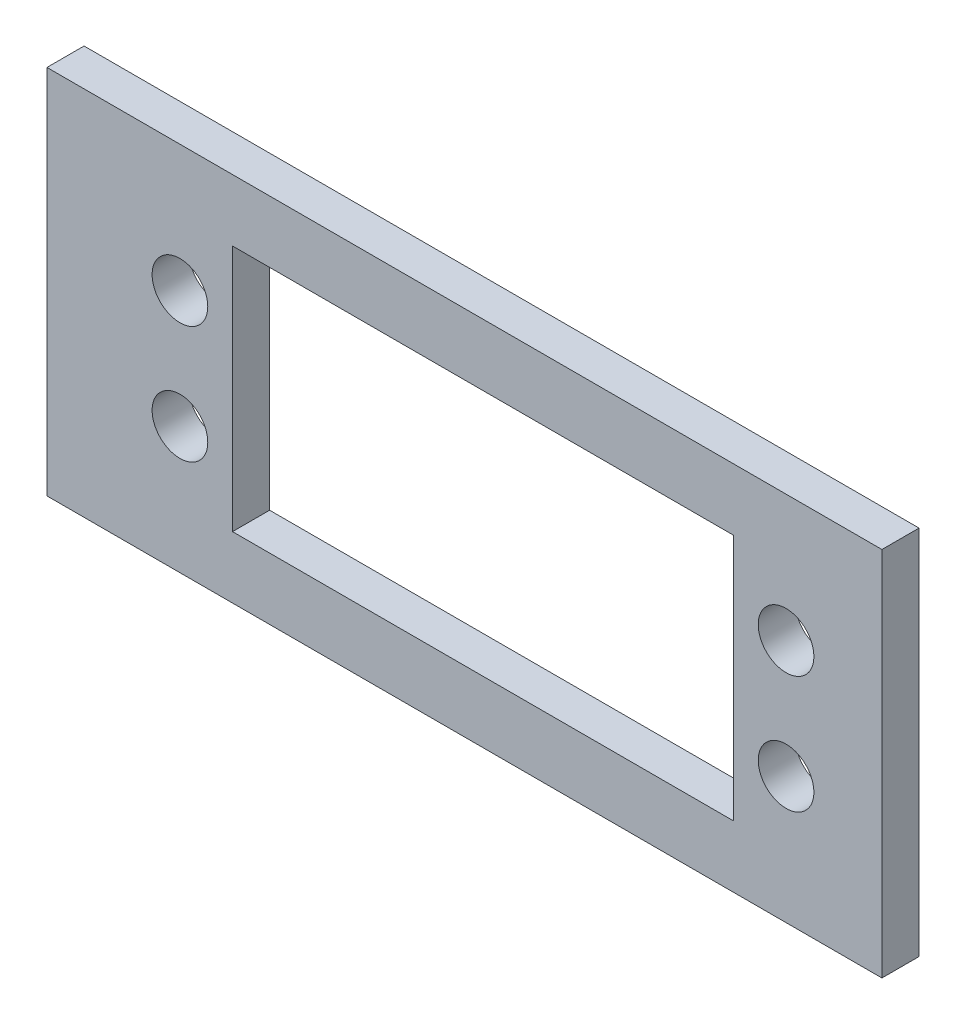
ISO-10303-21;
HEADER;
FILE_DESCRIPTION(('STEP AP214'),'2;1');
FILE_NAME('part.step','',(''),(''),'','','');
FILE_SCHEMA(('AUTOMOTIVE_DESIGN { 1 0 10303 214 1 1 1 1 }'));
ENDSEC;
DATA;
#1=APPLICATION_CONTEXT('core data for automotive mechanical design processes');
#2=APPLICATION_PROTOCOL_DEFINITION('international standard','automotive_design',2000,#1);
#3=PRODUCT_CONTEXT('',#1,'mechanical');
#4=PRODUCT('Part','Part','',(#3));
#5=PRODUCT_RELATED_PRODUCT_CATEGORY('part','',(#4));
#6=PRODUCT_DEFINITION_FORMATION('','',#4);
#7=PRODUCT_DEFINITION_CONTEXT('part definition',#1,'design');
#8=PRODUCT_DEFINITION('design','',#6,#7);
#9=PRODUCT_DEFINITION_SHAPE('','',#8);
#10=(LENGTH_UNIT() NAMED_UNIT(*) SI_UNIT(.MILLI.,.METRE.));
#11=(NAMED_UNIT(*) PLANE_ANGLE_UNIT() SI_UNIT($,.RADIAN.));
#12=(NAMED_UNIT(*) SI_UNIT($,.STERADIAN.) SOLID_ANGLE_UNIT());
#13=UNCERTAINTY_MEASURE_WITH_UNIT(LENGTH_MEASURE(1.E-05),#10,'distance_accuracy_value','');
#14=(GEOMETRIC_REPRESENTATION_CONTEXT(3) GLOBAL_UNCERTAINTY_ASSIGNED_CONTEXT((#13)) GLOBAL_UNIT_ASSIGNED_CONTEXT((#10,
#11,#12)) REPRESENTATION_CONTEXT('',''));
#15=CARTESIAN_POINT('',(0.,0.,0.));
#16=DIRECTION('',(0.,0.,1.));
#17=DIRECTION('',(1.,0.,0.));
#18=AXIS2_PLACEMENT_3D('',#15,#16,#17);
#19=CARTESIAN_POINT('',(0.,0.,3.));
#20=DIRECTION('',(0.,0.,-1.));
#21=DIRECTION('',(-1.,0.,0.));
#22=AXIS2_PLACEMENT_3D('',#19,#20,#21);
#23=PLANE('',#22);
#24=CARTESIAN_POINT('',(59.75,19.75,3.));
#25=DIRECTION('',(0.,0.,1.));
#26=DIRECTION('',(1.,0.,0.));
#27=AXIS2_PLACEMENT_3D('',#24,#25,#26);
#28=CIRCLE('',#27,2.25);
#29=CARTESIAN_POINT('',(62.,19.75,3.));
#30=VERTEX_POINT('',#29);
#31=EDGE_CURVE('E249',#30,#30,#28,.T.);
#32=ORIENTED_EDGE('',*,*,#31,.F.);
#33=EDGE_LOOP('',(#32));
#34=FACE_BOUND('',#33,.T.);
#35=CARTESIAN_POINT('',(10.75,19.75,3.));
#36=DIRECTION('',(0.,0.,1.));
#37=DIRECTION('',(1.,0.,0.));
#38=AXIS2_PLACEMENT_3D('',#35,#36,#37);
#39=CIRCLE('',#38,2.25);
#40=CARTESIAN_POINT('',(13.,19.75,3.));
#41=VERTEX_POINT('',#40);
#42=EDGE_CURVE('E130',#41,#41,#39,.T.);
#43=ORIENTED_EDGE('',*,*,#42,.F.);
#44=EDGE_LOOP('',(#43));
#45=FACE_BOUND('',#44,.T.);
#46=DIRECTION('',(0.,-1.,0.));
#47=VECTOR('',#46,1.);
#48=CARTESIAN_POINT('',(0.,0.,3.));
#49=LINE('',#48,#47);
#50=CARTESIAN_POINT('',(0.,30.,3.));
#51=VERTEX_POINT('',#50);
#52=CARTESIAN_POINT('',(0.,0.,3.));
#53=VERTEX_POINT('',#52);
#54=EDGE_CURVE('E140',#51,#53,#49,.T.);
#55=ORIENTED_EDGE('',*,*,#54,.T.);
#56=DIRECTION('',(1.,0.,0.));
#57=VECTOR('',#56,1.);
#58=CARTESIAN_POINT('',(0.,0.,3.));
#59=LINE('',#58,#57);
#60=CARTESIAN_POINT('',(67.5,0.,3.));
#61=VERTEX_POINT('',#60);
#62=EDGE_CURVE('E143',#53,#61,#59,.T.);
#63=ORIENTED_EDGE('',*,*,#62,.T.);
#64=DIRECTION('',(0.,1.,0.));
#65=VECTOR('',#64,1.);
#66=CARTESIAN_POINT('',(67.5,0.,3.));
#67=LINE('',#66,#65);
#68=CARTESIAN_POINT('',(67.5,30.,3.));
#69=VERTEX_POINT('',#68);
#70=EDGE_CURVE('E146',#61,#69,#67,.T.);
#71=ORIENTED_EDGE('',*,*,#70,.T.);
#72=DIRECTION('',(-1.,0.,0.));
#73=VECTOR('',#72,1.);
#74=CARTESIAN_POINT('',(0.,30.,3.));
#75=LINE('',#74,#73);
#76=EDGE_CURVE('E148',#69,#51,#75,.T.);
#77=ORIENTED_EDGE('',*,*,#76,.T.);
#78=EDGE_LOOP('',(#55,#63,#71,#77));
#79=FACE_BOUND('',#78,.T.);
#80=DIRECTION('',(0.,-1.,0.));
#81=VECTOR('',#80,1.);
#82=CARTESIAN_POINT('',(15.,5.,3.));
#83=LINE('',#82,#81);
#84=CARTESIAN_POINT('',(15.,25.,3.));
#85=VERTEX_POINT('',#84);
#86=CARTESIAN_POINT('',(15.,5.,3.));
#87=VERTEX_POINT('',#86);
#88=EDGE_CURVE('E101',#85,#87,#83,.T.);
#89=ORIENTED_EDGE('',*,*,#88,.F.);
#90=DIRECTION('',(-1.,0.,0.));
#91=VECTOR('',#90,1.);
#92=CARTESIAN_POINT('',(15.,25.,3.));
#93=LINE('',#92,#91);
#94=CARTESIAN_POINT('',(55.5,25.,3.));
#95=VERTEX_POINT('',#94);
#96=EDGE_CURVE('E124',#95,#85,#93,.T.);
#97=ORIENTED_EDGE('',*,*,#96,.F.);
#98=DIRECTION('',(0.,1.,0.));
#99=VECTOR('',#98,1.);
#100=CARTESIAN_POINT('',(55.5,5.,3.));
#101=LINE('',#100,#99);
#102=CARTESIAN_POINT('',(55.5,5.,3.));
#103=VERTEX_POINT('',#102);
#104=EDGE_CURVE('E122',#103,#95,#101,.T.);
#105=ORIENTED_EDGE('',*,*,#104,.F.);
#106=DIRECTION('',(1.,0.,0.));
#107=VECTOR('',#106,1.);
#108=CARTESIAN_POINT('',(15.,5.,3.));
#109=LINE('',#108,#107);
#110=EDGE_CURVE('E109',#87,#103,#109,.T.);
#111=ORIENTED_EDGE('',*,*,#110,.F.);
#112=EDGE_LOOP('',(#89,#97,#105,#111));
#113=FACE_BOUND('',#112,.T.);
#114=CARTESIAN_POINT('',(10.75,10.25,3.));
#115=DIRECTION('',(0.,0.,1.));
#116=DIRECTION('',(1.,0.,0.));
#117=AXIS2_PLACEMENT_3D('',#114,#115,#116);
#118=CIRCLE('',#117,2.25);
#119=CARTESIAN_POINT('',(13.,10.25,3.));
#120=VERTEX_POINT('',#119);
#121=EDGE_CURVE('E255',#120,#120,#118,.T.);
#122=ORIENTED_EDGE('',*,*,#121,.F.);
#123=EDGE_LOOP('',(#122));
#124=FACE_BOUND('',#123,.T.);
#125=CARTESIAN_POINT('',(59.75,10.25,3.));
#126=DIRECTION('',(0.,0.,1.));
#127=DIRECTION('',(1.,0.,0.));
#128=AXIS2_PLACEMENT_3D('',#125,#126,#127);
#129=CIRCLE('',#128,2.25);
#130=CARTESIAN_POINT('',(62.,10.25,3.));
#131=VERTEX_POINT('',#130);
#132=EDGE_CURVE('E240',#131,#131,#129,.T.);
#133=ORIENTED_EDGE('',*,*,#132,.F.);
#134=EDGE_LOOP('',(#133));
#135=FACE_BOUND('',#134,.T.);
#136=ADVANCED_FACE('F36',(#34,#45,#79,#113,#124,#135),#23,.F.);
#137=CARTESIAN_POINT('',(0.,0.,0.));
#138=DIRECTION('',(0.,0.,-1.));
#139=DIRECTION('',(-1.,0.,0.));
#140=AXIS2_PLACEMENT_3D('',#137,#138,#139);
#141=PLANE('',#140);
#142=CARTESIAN_POINT('',(59.75,19.75,0.));
#143=DIRECTION('',(0.,0.,1.));
#144=DIRECTION('',(1.,0.,0.));
#145=AXIS2_PLACEMENT_3D('',#142,#143,#144);
#146=CIRCLE('',#145,2.25);
#147=CARTESIAN_POINT('',(62.,19.75,0.));
#148=VERTEX_POINT('',#147);
#149=EDGE_CURVE('E246',#148,#148,#146,.T.);
#150=ORIENTED_EDGE('',*,*,#149,.T.);
#151=EDGE_LOOP('',(#150));
#152=FACE_BOUND('',#151,.T.);
#153=CARTESIAN_POINT('',(10.75,19.75,0.));
#154=DIRECTION('',(0.,0.,1.));
#155=DIRECTION('',(1.,0.,0.));
#156=AXIS2_PLACEMENT_3D('',#153,#154,#155);
#157=CIRCLE('',#156,2.25);
#158=CARTESIAN_POINT('',(13.,19.75,0.));
#159=VERTEX_POINT('',#158);
#160=EDGE_CURVE('E258',#159,#159,#157,.T.);
#161=ORIENTED_EDGE('',*,*,#160,.T.);
#162=EDGE_LOOP('',(#161));
#163=FACE_BOUND('',#162,.T.);
#164=DIRECTION('',(0.,-1.,0.));
#165=VECTOR('',#164,1.);
#166=CARTESIAN_POINT('',(0.,0.,0.));
#167=LINE('',#166,#165);
#168=CARTESIAN_POINT('',(0.,30.,0.));
#169=VERTEX_POINT('',#168);
#170=CARTESIAN_POINT('',(0.,0.,0.));
#171=VERTEX_POINT('',#170);
#172=EDGE_CURVE('E117',#169,#171,#167,.T.);
#173=ORIENTED_EDGE('',*,*,#172,.F.);
#174=DIRECTION('',(-1.,0.,0.));
#175=VECTOR('',#174,1.);
#176=CARTESIAN_POINT('',(0.,30.,0.));
#177=LINE('',#176,#175);
#178=CARTESIAN_POINT('',(67.5,30.,0.));
#179=VERTEX_POINT('',#178);
#180=EDGE_CURVE('E144',#179,#169,#177,.T.);
#181=ORIENTED_EDGE('',*,*,#180,.F.);
#182=DIRECTION('',(0.,1.,0.));
#183=VECTOR('',#182,1.);
#184=CARTESIAN_POINT('',(67.5,0.,0.));
#185=LINE('',#184,#183);
#186=CARTESIAN_POINT('',(67.5,0.,0.));
#187=VERTEX_POINT('',#186);
#188=EDGE_CURVE('E155',#187,#179,#185,.T.);
#189=ORIENTED_EDGE('',*,*,#188,.F.);
#190=DIRECTION('',(1.,0.,0.));
#191=VECTOR('',#190,1.);
#192=CARTESIAN_POINT('',(0.,0.,0.));
#193=LINE('',#192,#191);
#194=EDGE_CURVE('E153',#171,#187,#193,.T.);
#195=ORIENTED_EDGE('',*,*,#194,.F.);
#196=EDGE_LOOP('',(#173,#181,#189,#195));
#197=FACE_BOUND('',#196,.T.);
#198=DIRECTION('',(-1.,0.,0.));
#199=VECTOR('',#198,1.);
#200=CARTESIAN_POINT('',(15.,25.,0.));
#201=LINE('',#200,#199);
#202=CARTESIAN_POINT('',(55.5,25.,0.));
#203=VERTEX_POINT('',#202);
#204=CARTESIAN_POINT('',(15.,25.,0.));
#205=VERTEX_POINT('',#204);
#206=EDGE_CURVE('E110',#203,#205,#201,.T.);
#207=ORIENTED_EDGE('',*,*,#206,.T.);
#208=DIRECTION('',(0.,-1.,0.));
#209=VECTOR('',#208,1.);
#210=CARTESIAN_POINT('',(15.,5.,0.));
#211=LINE('',#210,#209);
#212=CARTESIAN_POINT('',(15.,5.,0.));
#213=VERTEX_POINT('',#212);
#214=EDGE_CURVE('E59',#205,#213,#211,.T.);
#215=ORIENTED_EDGE('',*,*,#214,.T.);
#216=DIRECTION('',(1.,0.,0.));
#217=VECTOR('',#216,1.);
#218=CARTESIAN_POINT('',(15.,5.,0.));
#219=LINE('',#218,#217);
#220=CARTESIAN_POINT('',(55.5,5.,0.));
#221=VERTEX_POINT('',#220);
#222=EDGE_CURVE('E116',#213,#221,#219,.T.);
#223=ORIENTED_EDGE('',*,*,#222,.T.);
#224=DIRECTION('',(0.,1.,0.));
#225=VECTOR('',#224,1.);
#226=CARTESIAN_POINT('',(55.5,5.,0.));
#227=LINE('',#226,#225);
#228=EDGE_CURVE('E132',#221,#203,#227,.T.);
#229=ORIENTED_EDGE('',*,*,#228,.T.);
#230=EDGE_LOOP('',(#207,#215,#223,#229));
#231=FACE_BOUND('',#230,.T.);
#232=CARTESIAN_POINT('',(10.75,10.25,0.));
#233=DIRECTION('',(0.,0.,1.));
#234=DIRECTION('',(1.,0.,0.));
#235=AXIS2_PLACEMENT_3D('',#232,#233,#234);
#236=CIRCLE('',#235,2.25);
#237=CARTESIAN_POINT('',(13.,10.25,0.));
#238=VERTEX_POINT('',#237);
#239=EDGE_CURVE('E252',#238,#238,#236,.T.);
#240=ORIENTED_EDGE('',*,*,#239,.T.);
#241=EDGE_LOOP('',(#240));
#242=FACE_BOUND('',#241,.T.);
#243=CARTESIAN_POINT('',(59.75,10.25,0.));
#244=DIRECTION('',(0.,0.,1.));
#245=DIRECTION('',(1.,0.,0.));
#246=AXIS2_PLACEMENT_3D('',#243,#244,#245);
#247=CIRCLE('',#246,2.25);
#248=CARTESIAN_POINT('',(62.,10.25,0.));
#249=VERTEX_POINT('',#248);
#250=EDGE_CURVE('E243',#249,#249,#247,.T.);
#251=ORIENTED_EDGE('',*,*,#250,.T.);
#252=EDGE_LOOP('',(#251));
#253=FACE_BOUND('',#252,.T.);
#254=ADVANCED_FACE('F173',(#152,#163,#197,#231,#242,#253),#141,.T.);
#255=CARTESIAN_POINT('',(0.,0.,3.));
#256=DIRECTION('',(1.,0.,0.));
#257=DIRECTION('',(0.,0.,-1.));
#258=AXIS2_PLACEMENT_3D('',#255,#256,#257);
#259=PLANE('',#258);
#260=ORIENTED_EDGE('',*,*,#172,.T.);
#261=DIRECTION('',(0.,0.,-1.));
#262=VECTOR('',#261,1.);
#263=CARTESIAN_POINT('',(0.,0.,3.));
#264=LINE('',#263,#262);
#265=EDGE_CURVE('E11',#53,#171,#264,.T.);
#266=ORIENTED_EDGE('',*,*,#265,.F.);
#267=ORIENTED_EDGE('',*,*,#54,.F.);
#268=DIRECTION('',(0.,0.,-1.));
#269=VECTOR('',#268,1.);
#270=CARTESIAN_POINT('',(0.,30.,3.));
#271=LINE('',#270,#269);
#272=EDGE_CURVE('E150',#51,#169,#271,.T.);
#273=ORIENTED_EDGE('',*,*,#272,.T.);
#274=EDGE_LOOP('',(#260,#266,#267,#273));
#275=FACE_BOUND('',#274,.T.);
#276=ADVANCED_FACE('F38',(#275),#259,.F.);
#277=CARTESIAN_POINT('',(0.,0.,3.));
#278=DIRECTION('',(0.,1.,0.));
#279=DIRECTION('',(0.,0.,1.));
#280=AXIS2_PLACEMENT_3D('',#277,#278,#279);
#281=PLANE('',#280);
#282=ORIENTED_EDGE('',*,*,#194,.T.);
#283=DIRECTION('',(0.,0.,-1.));
#284=VECTOR('',#283,1.);
#285=CARTESIAN_POINT('',(67.5,0.,3.));
#286=LINE('',#285,#284);
#287=EDGE_CURVE('E44',#61,#187,#286,.T.);
#288=ORIENTED_EDGE('',*,*,#287,.F.);
#289=ORIENTED_EDGE('',*,*,#62,.F.);
#290=ORIENTED_EDGE('',*,*,#265,.T.);
#291=EDGE_LOOP('',(#282,#288,#289,#290));
#292=FACE_BOUND('',#291,.T.);
#293=ADVANCED_FACE('F183',(#292),#281,.F.);
#294=CARTESIAN_POINT('',(67.5,0.,3.));
#295=DIRECTION('',(-1.,0.,0.));
#296=DIRECTION('',(0.,0.,1.));
#297=AXIS2_PLACEMENT_3D('',#294,#295,#296);
#298=PLANE('',#297);
#299=ORIENTED_EDGE('',*,*,#188,.T.);
#300=DIRECTION('',(0.,0.,-1.));
#301=VECTOR('',#300,1.);
#302=CARTESIAN_POINT('',(67.5,30.,3.));
#303=LINE('',#302,#301);
#304=EDGE_CURVE('E160',#69,#179,#303,.T.);
#305=ORIENTED_EDGE('',*,*,#304,.F.);
#306=ORIENTED_EDGE('',*,*,#70,.F.);
#307=ORIENTED_EDGE('',*,*,#287,.T.);
#308=EDGE_LOOP('',(#299,#305,#306,#307));
#309=FACE_BOUND('',#308,.T.);
#310=ADVANCED_FACE('F167',(#309),#298,.F.);
#311=CARTESIAN_POINT('',(0.,30.,3.));
#312=DIRECTION('',(0.,-1.,0.));
#313=DIRECTION('',(0.,0.,-1.));
#314=AXIS2_PLACEMENT_3D('',#311,#312,#313);
#315=PLANE('',#314);
#316=ORIENTED_EDGE('',*,*,#180,.T.);
#317=ORIENTED_EDGE('',*,*,#272,.F.);
#318=ORIENTED_EDGE('',*,*,#76,.F.);
#319=ORIENTED_EDGE('',*,*,#304,.T.);
#320=EDGE_LOOP('',(#316,#317,#318,#319));
#321=FACE_BOUND('',#320,.T.);
#322=ADVANCED_FACE('F177',(#321),#315,.F.);
#323=CARTESIAN_POINT('',(15.,5.,3.));
#324=DIRECTION('',(1.,0.,0.));
#325=DIRECTION('',(0.,0.,-1.));
#326=AXIS2_PLACEMENT_3D('',#323,#324,#325);
#327=PLANE('',#326);
#328=ORIENTED_EDGE('',*,*,#214,.F.);
#329=DIRECTION('',(0.,0.,-1.));
#330=VECTOR('',#329,1.);
#331=CARTESIAN_POINT('',(15.,25.,3.));
#332=LINE('',#331,#330);
#333=EDGE_CURVE('E105',#85,#205,#332,.T.);
#334=ORIENTED_EDGE('',*,*,#333,.F.);
#335=ORIENTED_EDGE('',*,*,#88,.T.);
#336=DIRECTION('',(0.,0.,-1.));
#337=VECTOR('',#336,1.);
#338=CARTESIAN_POINT('',(15.,5.,3.));
#339=LINE('',#338,#337);
#340=EDGE_CURVE('E104',#87,#213,#339,.T.);
#341=ORIENTED_EDGE('',*,*,#340,.T.);
#342=EDGE_LOOP('',(#328,#334,#335,#341));
#343=FACE_BOUND('',#342,.T.);
#344=ADVANCED_FACE('F103',(#343),#327,.T.);
#345=CARTESIAN_POINT('',(15.,5.,3.));
#346=DIRECTION('',(0.,1.,0.));
#347=DIRECTION('',(-1.,0.,0.));
#348=AXIS2_PLACEMENT_3D('',#345,#346,#347);
#349=PLANE('',#348);
#350=ORIENTED_EDGE('',*,*,#222,.F.);
#351=ORIENTED_EDGE('',*,*,#340,.F.);
#352=ORIENTED_EDGE('',*,*,#110,.T.);
#353=DIRECTION('',(0.,0.,-1.));
#354=VECTOR('',#353,1.);
#355=CARTESIAN_POINT('',(55.5,5.,3.));
#356=LINE('',#355,#354);
#357=EDGE_CURVE('E118',#103,#221,#356,.T.);
#358=ORIENTED_EDGE('',*,*,#357,.T.);
#359=EDGE_LOOP('',(#350,#351,#352,#358));
#360=FACE_BOUND('',#359,.T.);
#361=ADVANCED_FACE('F113',(#360),#349,.T.);
#362=CARTESIAN_POINT('',(55.5,5.,3.));
#363=DIRECTION('',(-1.,0.,0.));
#364=DIRECTION('',(0.,0.,1.));
#365=AXIS2_PLACEMENT_3D('',#362,#363,#364);
#366=PLANE('',#365);
#367=ORIENTED_EDGE('',*,*,#228,.F.);
#368=ORIENTED_EDGE('',*,*,#357,.F.);
#369=ORIENTED_EDGE('',*,*,#104,.T.);
#370=DIRECTION('',(0.,0.,-1.));
#371=VECTOR('',#370,1.);
#372=CARTESIAN_POINT('',(55.5,25.,3.));
#373=LINE('',#372,#371);
#374=EDGE_CURVE('E51',#95,#203,#373,.T.);
#375=ORIENTED_EDGE('',*,*,#374,.T.);
#376=EDGE_LOOP('',(#367,#368,#369,#375));
#377=FACE_BOUND('',#376,.T.);
#378=ADVANCED_FACE('F210',(#377),#366,.T.);
#379=CARTESIAN_POINT('',(15.,25.,3.));
#380=DIRECTION('',(0.,-1.,0.));
#381=DIRECTION('',(0.,0.,-1.));
#382=AXIS2_PLACEMENT_3D('',#379,#380,#381);
#383=PLANE('',#382);
#384=ORIENTED_EDGE('',*,*,#206,.F.);
#385=ORIENTED_EDGE('',*,*,#374,.F.);
#386=ORIENTED_EDGE('',*,*,#96,.T.);
#387=ORIENTED_EDGE('',*,*,#333,.T.);
#388=EDGE_LOOP('',(#384,#385,#386,#387));
#389=FACE_BOUND('',#388,.T.);
#390=ADVANCED_FACE('F214',(#389),#383,.T.);
#391=CARTESIAN_POINT('',(10.75,19.75,3.));
#392=DIRECTION('',(0.,0.,-1.));
#393=DIRECTION('',(-1.,0.,0.));
#394=AXIS2_PLACEMENT_3D('',#391,#392,#393);
#395=CYLINDRICAL_SURFACE('',#394,2.25);
#396=ORIENTED_EDGE('',*,*,#42,.T.);
#397=EDGE_LOOP('',(#396));
#398=FACE_BOUND('',#397,.T.);
#399=ORIENTED_EDGE('',*,*,#160,.F.);
#400=EDGE_LOOP('',(#399));
#401=FACE_BOUND('',#400,.T.);
#402=ADVANCED_FACE('F220',(#398,#401),#395,.F.);
#403=CARTESIAN_POINT('',(10.75,10.25,3.));
#404=DIRECTION('',(0.,0.,-1.));
#405=DIRECTION('',(-1.,0.,0.));
#406=AXIS2_PLACEMENT_3D('',#403,#404,#405);
#407=CYLINDRICAL_SURFACE('',#406,2.25);
#408=ORIENTED_EDGE('',*,*,#121,.T.);
#409=EDGE_LOOP('',(#408));
#410=FACE_BOUND('',#409,.T.);
#411=ORIENTED_EDGE('',*,*,#239,.F.);
#412=EDGE_LOOP('',(#411));
#413=FACE_BOUND('',#412,.T.);
#414=ADVANCED_FACE('F223',(#410,#413),#407,.F.);
#415=CARTESIAN_POINT('',(59.75,19.75,3.));
#416=DIRECTION('',(0.,0.,-1.));
#417=DIRECTION('',(-1.,0.,0.));
#418=AXIS2_PLACEMENT_3D('',#415,#416,#417);
#419=CYLINDRICAL_SURFACE('',#418,2.25);
#420=ORIENTED_EDGE('',*,*,#31,.T.);
#421=EDGE_LOOP('',(#420));
#422=FACE_BOUND('',#421,.T.);
#423=ORIENTED_EDGE('',*,*,#149,.F.);
#424=EDGE_LOOP('',(#423));
#425=FACE_BOUND('',#424,.T.);
#426=ADVANCED_FACE('F227',(#422,#425),#419,.F.);
#427=CARTESIAN_POINT('',(59.75,10.25,3.));
#428=DIRECTION('',(0.,0.,-1.));
#429=DIRECTION('',(-1.,0.,0.));
#430=AXIS2_PLACEMENT_3D('',#427,#428,#429);
#431=CYLINDRICAL_SURFACE('',#430,2.25);
#432=ORIENTED_EDGE('',*,*,#132,.T.);
#433=EDGE_LOOP('',(#432));
#434=FACE_BOUND('',#433,.T.);
#435=ORIENTED_EDGE('',*,*,#250,.F.);
#436=EDGE_LOOP('',(#435));
#437=FACE_BOUND('',#436,.T.);
#438=ADVANCED_FACE('F231',(#434,#437),#431,.F.);
#439=CLOSED_SHELL('',(#136,#254,#276,#293,#310,#322,#344,#361,#378,#390,#402,#414,#426,#438));
#440=MANIFOLD_SOLID_BREP('B2',#439);
#441=ADVANCED_BREP_SHAPE_REPRESENTATION('',(#18,#440),#14);
#442=SHAPE_DEFINITION_REPRESENTATION(#9,#441);
ENDSEC;
END-ISO-10303-21;
